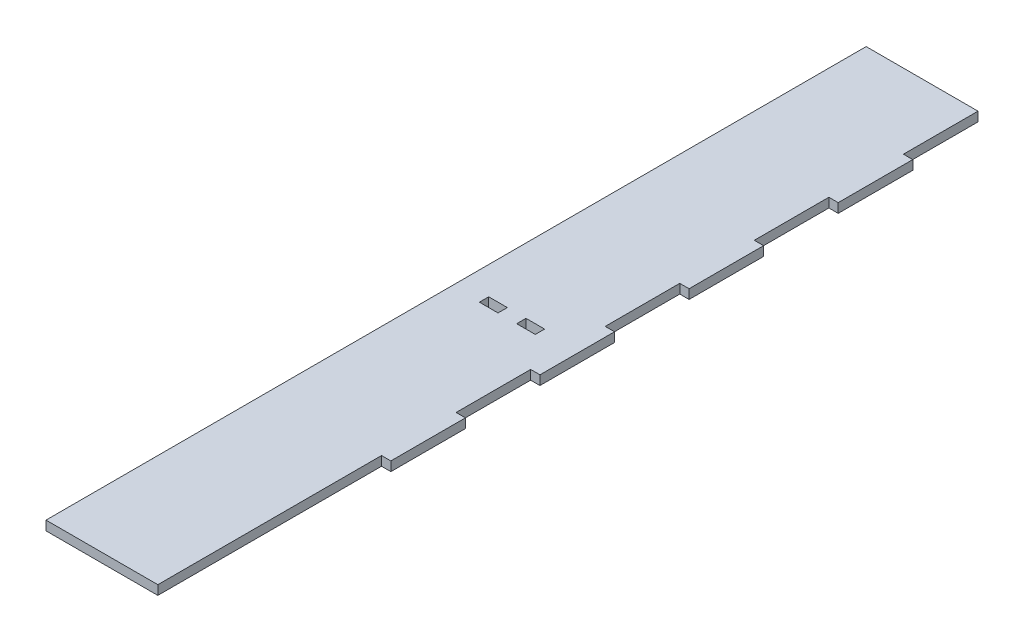
ISO-10303-21;
HEADER;
FILE_DESCRIPTION(('STEP AP214'),'2;1');
FILE_NAME('part.step','',(''),(''),'','','');
FILE_SCHEMA(('AUTOMOTIVE_DESIGN { 1 0 10303 214 1 1 1 1 }'));
ENDSEC;
DATA;
#1=APPLICATION_CONTEXT('core data for automotive mechanical design processes');
#2=APPLICATION_PROTOCOL_DEFINITION('international standard','automotive_design',2000,#1);
#3=PRODUCT_CONTEXT('',#1,'mechanical');
#4=PRODUCT('Part','Part','',(#3));
#5=PRODUCT_RELATED_PRODUCT_CATEGORY('part','',(#4));
#6=PRODUCT_DEFINITION_FORMATION('','',#4);
#7=PRODUCT_DEFINITION_CONTEXT('part definition',#1,'design');
#8=PRODUCT_DEFINITION('design','',#6,#7);
#9=PRODUCT_DEFINITION_SHAPE('','',#8);
#10=(LENGTH_UNIT() NAMED_UNIT(*) SI_UNIT(.MILLI.,.METRE.));
#11=(NAMED_UNIT(*) PLANE_ANGLE_UNIT() SI_UNIT($,.RADIAN.));
#12=(NAMED_UNIT(*) SI_UNIT($,.STERADIAN.) SOLID_ANGLE_UNIT());
#13=UNCERTAINTY_MEASURE_WITH_UNIT(LENGTH_MEASURE(1.E-05),#10,'distance_accuracy_value','');
#14=(GEOMETRIC_REPRESENTATION_CONTEXT(3) GLOBAL_UNCERTAINTY_ASSIGNED_CONTEXT((#13)) GLOBAL_UNIT_ASSIGNED_CONTEXT((#10,
#11,#12)) REPRESENTATION_CONTEXT('',''));
#15=CARTESIAN_POINT('',(0.,0.,0.));
#16=DIRECTION('',(0.,0.,1.));
#17=DIRECTION('',(1.,0.,0.));
#18=AXIS2_PLACEMENT_3D('',#15,#16,#17);
#19=CARTESIAN_POINT('',(38.1,38.1,558.8));
#20=DIRECTION('',(-1.,0.,0.));
#21=DIRECTION('',(0.,0.,1.));
#22=AXIS2_PLACEMENT_3D('',#19,#20,#21);
#23=PLANE('',#22);
#24=DIRECTION('',(0.,1.,0.));
#25=VECTOR('',#24,1.);
#26=CARTESIAN_POINT('',(38.1,44.45,50.8));
#27=LINE('',#26,#25);
#28=CARTESIAN_POINT('',(38.1,38.1,50.8));
#29=VERTEX_POINT('',#28);
#30=CARTESIAN_POINT('',(38.1,44.45,50.8));
#31=VERTEX_POINT('',#30);
#32=EDGE_CURVE('E234',#29,#31,#27,.T.);
#33=ORIENTED_EDGE('',*,*,#32,.F.);
#34=DIRECTION('',(0.,0.,-1.));
#35=VECTOR('',#34,1.);
#36=CARTESIAN_POINT('',(38.1,38.1,558.8));
#37=LINE('',#36,#35);
#38=CARTESIAN_POINT('',(38.1,38.1,0.));
#39=VERTEX_POINT('',#38);
#40=EDGE_CURVE('E221',#29,#39,#37,.T.);
#41=ORIENTED_EDGE('',*,*,#40,.T.);
#42=DIRECTION('',(0.,1.,0.));
#43=VECTOR('',#42,1.);
#44=CARTESIAN_POINT('',(38.1,38.1,0.));
#45=LINE('',#44,#43);
#46=CARTESIAN_POINT('',(38.1,44.45,0.));
#47=VERTEX_POINT('',#46);
#48=EDGE_CURVE('E503',#39,#47,#45,.T.);
#49=ORIENTED_EDGE('',*,*,#48,.T.);
#50=DIRECTION('',(0.,0.,-1.));
#51=VECTOR('',#50,1.);
#52=CARTESIAN_POINT('',(38.1,44.45,558.8));
#53=LINE('',#52,#51);
#54=EDGE_CURVE('E37',#31,#47,#53,.T.);
#55=ORIENTED_EDGE('',*,*,#54,.F.);
#56=EDGE_LOOP('',(#33,#41,#49,#55));
#57=FACE_BOUND('',#56,.T.);
#58=ADVANCED_FACE('F33',(#57),#23,.F.);
#59=DIRECTION('',(0.,-1.,0.));
#60=VECTOR('',#59,1.);
#61=CARTESIAN_POINT('',(38.1,44.45,101.6));
#62=LINE('',#61,#60);
#63=CARTESIAN_POINT('',(38.1,44.45,101.6));
#64=VERTEX_POINT('',#63);
#65=CARTESIAN_POINT('',(38.1,38.1,101.6));
#66=VERTEX_POINT('',#65);
#67=EDGE_CURVE('E58',#64,#66,#62,.T.);
#68=ORIENTED_EDGE('',*,*,#67,.F.);
#69=CARTESIAN_POINT('',(38.1,44.45,152.4));
#70=VERTEX_POINT('',#69);
#71=EDGE_CURVE('E364',#70,#64,#53,.T.);
#72=ORIENTED_EDGE('',*,*,#71,.F.);
#73=DIRECTION('',(0.,1.,0.));
#74=VECTOR('',#73,1.);
#75=CARTESIAN_POINT('',(38.1,44.45,152.4));
#76=LINE('',#75,#74);
#77=CARTESIAN_POINT('',(38.1,38.1,152.4));
#78=VERTEX_POINT('',#77);
#79=EDGE_CURVE('E266',#78,#70,#76,.T.);
#80=ORIENTED_EDGE('',*,*,#79,.F.);
#81=EDGE_CURVE('E231',#78,#66,#37,.T.);
#82=ORIENTED_EDGE('',*,*,#81,.T.);
#83=EDGE_LOOP('',(#68,#72,#80,#82));
#84=FACE_BOUND('',#83,.T.);
#85=ADVANCED_FACE('F393',(#84),#23,.F.);
#86=DIRECTION('',(0.,-1.,0.));
#87=VECTOR('',#86,1.);
#88=CARTESIAN_POINT('',(38.1,44.45,203.2));
#89=LINE('',#88,#87);
#90=CARTESIAN_POINT('',(38.1,44.45,203.2));
#91=VERTEX_POINT('',#90);
#92=CARTESIAN_POINT('',(38.1,38.1,203.2));
#93=VERTEX_POINT('',#92);
#94=EDGE_CURVE('E263',#91,#93,#89,.T.);
#95=ORIENTED_EDGE('',*,*,#94,.F.);
#96=CARTESIAN_POINT('',(38.1,44.45,254.));
#97=VERTEX_POINT('',#96);
#98=EDGE_CURVE('E346',#97,#91,#53,.T.);
#99=ORIENTED_EDGE('',*,*,#98,.F.);
#100=DIRECTION('',(0.,1.,0.));
#101=VECTOR('',#100,1.);
#102=CARTESIAN_POINT('',(38.1,44.45,254.));
#103=LINE('',#102,#101);
#104=CARTESIAN_POINT('',(38.1,38.1,254.));
#105=VERTEX_POINT('',#104);
#106=EDGE_CURVE('E297',#105,#97,#103,.T.);
#107=ORIENTED_EDGE('',*,*,#106,.F.);
#108=EDGE_CURVE('E342',#105,#93,#37,.T.);
#109=ORIENTED_EDGE('',*,*,#108,.T.);
#110=EDGE_LOOP('',(#95,#99,#107,#109));
#111=FACE_BOUND('',#110,.T.);
#112=ADVANCED_FACE('F416',(#111),#23,.F.);
#113=DIRECTION('',(0.,-1.,0.));
#114=VECTOR('',#113,1.);
#115=CARTESIAN_POINT('',(38.1,44.45,304.8));
#116=LINE('',#115,#114);
#117=CARTESIAN_POINT('',(38.1,44.45,304.8));
#118=VERTEX_POINT('',#117);
#119=CARTESIAN_POINT('',(38.1,38.1,304.8));
#120=VERTEX_POINT('',#119);
#121=EDGE_CURVE('E262',#118,#120,#116,.T.);
#122=ORIENTED_EDGE('',*,*,#121,.F.);
#123=CARTESIAN_POINT('',(38.1,44.45,355.6));
#124=VERTEX_POINT('',#123);
#125=EDGE_CURVE('E43',#124,#118,#53,.T.);
#126=ORIENTED_EDGE('',*,*,#125,.F.);
#127=DIRECTION('',(0.,1.,0.));
#128=VECTOR('',#127,1.);
#129=CARTESIAN_POINT('',(38.1,38.1,355.6));
#130=LINE('',#129,#128);
#131=CARTESIAN_POINT('',(38.1,38.1,355.6));
#132=VERTEX_POINT('',#131);
#133=EDGE_CURVE('E333',#132,#124,#130,.T.);
#134=ORIENTED_EDGE('',*,*,#133,.F.);
#135=EDGE_CURVE('E345',#132,#120,#37,.T.);
#136=ORIENTED_EDGE('',*,*,#135,.T.);
#137=EDGE_LOOP('',(#122,#126,#134,#136));
#138=FACE_BOUND('',#137,.T.);
#139=ADVANCED_FACE('F418',(#138),#23,.F.);
#140=DIRECTION('',(0.,-1.,0.));
#141=VECTOR('',#140,1.);
#142=CARTESIAN_POINT('',(38.1,38.1,406.4));
#143=LINE('',#142,#141);
#144=CARTESIAN_POINT('',(38.1,44.45,406.4));
#145=VERTEX_POINT('',#144);
#146=CARTESIAN_POINT('',(38.1,38.1,406.4));
#147=VERTEX_POINT('',#146);
#148=EDGE_CURVE('E294',#145,#147,#143,.T.);
#149=ORIENTED_EDGE('',*,*,#148,.F.);
#150=CARTESIAN_POINT('',(38.1,44.45,558.8));
#151=VERTEX_POINT('',#150);
#152=EDGE_CURVE('E11',#151,#145,#53,.T.);
#153=ORIENTED_EDGE('',*,*,#152,.F.);
#154=DIRECTION('',(0.,1.,0.));
#155=VECTOR('',#154,1.);
#156=CARTESIAN_POINT('',(38.1,38.1,558.8));
#157=LINE('',#156,#155);
#158=CARTESIAN_POINT('',(38.1,38.1,558.8));
#159=VERTEX_POINT('',#158);
#160=EDGE_CURVE('E510',#159,#151,#157,.T.);
#161=ORIENTED_EDGE('',*,*,#160,.F.);
#162=EDGE_CURVE('E361',#159,#147,#37,.T.);
#163=ORIENTED_EDGE('',*,*,#162,.T.);
#164=EDGE_LOOP('',(#149,#153,#161,#163));
#165=FACE_BOUND('',#164,.T.);
#166=ADVANCED_FACE('F35',(#165),#23,.F.);
#167=CARTESIAN_POINT('',(38.1,44.45,558.8));
#168=DIRECTION('',(0.,-1.,0.));
#169=DIRECTION('',(0.,0.,-1.));
#170=AXIS2_PLACEMENT_3D('',#167,#168,#169);
#171=PLANE('',#170);
#172=DIRECTION('',(-1.,0.,0.));
#173=VECTOR('',#172,1.);
#174=CARTESIAN_POINT('',(-6.35,44.45,276.225));
#175=LINE('',#174,#173);
#176=CARTESIAN_POINT('',(-6.35,44.45,276.225));
#177=VERTEX_POINT('',#176);
#178=CARTESIAN_POINT('',(-19.05,44.45,276.225));
#179=VERTEX_POINT('',#178);
#180=EDGE_CURVE('E461',#177,#179,#175,.T.);
#181=ORIENTED_EDGE('',*,*,#180,.F.);
#182=DIRECTION('',(0.,0.,-1.));
#183=VECTOR('',#182,1.);
#184=CARTESIAN_POINT('',(-6.35,44.45,282.575));
#185=LINE('',#184,#183);
#186=CARTESIAN_POINT('',(-6.35,44.45,282.575));
#187=VERTEX_POINT('',#186);
#188=EDGE_CURVE('E324',#187,#177,#185,.T.);
#189=ORIENTED_EDGE('',*,*,#188,.F.);
#190=DIRECTION('',(1.,0.,0.));
#191=VECTOR('',#190,1.);
#192=CARTESIAN_POINT('',(-6.35,44.45,282.575));
#193=LINE('',#192,#191);
#194=CARTESIAN_POINT('',(-19.05,44.45,282.575));
#195=VERTEX_POINT('',#194);
#196=EDGE_CURVE('E450',#195,#187,#193,.T.);
#197=ORIENTED_EDGE('',*,*,#196,.F.);
#198=DIRECTION('',(0.,0.,1.));
#199=VECTOR('',#198,1.);
#200=CARTESIAN_POINT('',(-19.05,44.45,282.575));
#201=LINE('',#200,#199);
#202=EDGE_CURVE('E464',#179,#195,#201,.T.);
#203=ORIENTED_EDGE('',*,*,#202,.F.);
#204=EDGE_LOOP('',(#181,#189,#197,#203));
#205=FACE_BOUND('',#204,.T.);
#206=DIRECTION('',(-1.,0.,0.));
#207=VECTOR('',#206,1.);
#208=CARTESIAN_POINT('',(19.05,44.45,276.225));
#209=LINE('',#208,#207);
#210=CARTESIAN_POINT('',(19.05,44.45,276.225));
#211=VERTEX_POINT('',#210);
#212=CARTESIAN_POINT('',(6.35,44.45,276.225));
#213=VERTEX_POINT('',#212);
#214=EDGE_CURVE('E493',#211,#213,#209,.T.);
#215=ORIENTED_EDGE('',*,*,#214,.F.);
#216=DIRECTION('',(0.,0.,-1.));
#217=VECTOR('',#216,1.);
#218=CARTESIAN_POINT('',(19.05,44.45,282.575));
#219=LINE('',#218,#217);
#220=CARTESIAN_POINT('',(19.05,44.45,282.575));
#221=VERTEX_POINT('',#220);
#222=EDGE_CURVE('E471',#221,#211,#219,.T.);
#223=ORIENTED_EDGE('',*,*,#222,.F.);
#224=DIRECTION('',(1.,0.,0.));
#225=VECTOR('',#224,1.);
#226=CARTESIAN_POINT('',(19.05,44.45,282.575));
#227=LINE('',#226,#225);
#228=CARTESIAN_POINT('',(6.35,44.45,282.575));
#229=VERTEX_POINT('',#228);
#230=EDGE_CURVE('E482',#229,#221,#227,.T.);
#231=ORIENTED_EDGE('',*,*,#230,.F.);
#232=DIRECTION('',(0.,0.,1.));
#233=VECTOR('',#232,1.);
#234=CARTESIAN_POINT('',(6.35,44.45,282.575));
#235=LINE('',#234,#233);
#236=EDGE_CURVE('E496',#213,#229,#235,.T.);
#237=ORIENTED_EDGE('',*,*,#236,.F.);
#238=EDGE_LOOP('',(#215,#223,#231,#237));
#239=FACE_BOUND('',#238,.T.);
#240=DIRECTION('',(-1.,0.,0.));
#241=VECTOR('',#240,1.);
#242=CARTESIAN_POINT('',(38.1,44.45,0.));
#243=LINE('',#242,#241);
#244=CARTESIAN_POINT('',(-38.1,44.45,0.));
#245=VERTEX_POINT('',#244);
#246=EDGE_CURVE('E517',#47,#245,#243,.T.);
#247=ORIENTED_EDGE('',*,*,#246,.T.);
#248=DIRECTION('',(0.,0.,-1.));
#249=VECTOR('',#248,1.);
#250=CARTESIAN_POINT('',(-38.1,44.45,558.8));
#251=LINE('',#250,#249);
#252=CARTESIAN_POINT('',(-38.1,44.45,558.8));
#253=VERTEX_POINT('',#252);
#254=EDGE_CURVE('E366',#253,#245,#251,.T.);
#255=ORIENTED_EDGE('',*,*,#254,.F.);
#256=DIRECTION('',(-1.,0.,0.));
#257=VECTOR('',#256,1.);
#258=CARTESIAN_POINT('',(38.1,44.45,558.8));
#259=LINE('',#258,#257);
#260=EDGE_CURVE('E436',#151,#253,#259,.T.);
#261=ORIENTED_EDGE('',*,*,#260,.F.);
#262=ORIENTED_EDGE('',*,*,#152,.T.);
#263=DIRECTION('',(-1.,0.,0.));
#264=VECTOR('',#263,1.);
#265=CARTESIAN_POINT('',(95.6453367016958,44.45,406.4));
#266=LINE('',#265,#264);
#267=CARTESIAN_POINT('',(44.45,44.45,406.4));
#268=VERTEX_POINT('',#267);
#269=EDGE_CURVE('E336',#268,#145,#266,.T.);
#270=ORIENTED_EDGE('',*,*,#269,.F.);
#271=DIRECTION('',(0.,0.,-1.));
#272=VECTOR('',#271,1.);
#273=CARTESIAN_POINT('',(44.45,44.45,406.4));
#274=LINE('',#273,#272);
#275=CARTESIAN_POINT('',(44.45,44.45,355.6));
#276=VERTEX_POINT('',#275);
#277=EDGE_CURVE('E318',#268,#276,#274,.T.);
#278=ORIENTED_EDGE('',*,*,#277,.T.);
#279=DIRECTION('',(-1.,0.,0.));
#280=VECTOR('',#279,1.);
#281=CARTESIAN_POINT('',(95.6453367016958,44.45,355.6));
#282=LINE('',#281,#280);
#283=EDGE_CURVE('E339',#276,#124,#282,.T.);
#284=ORIENTED_EDGE('',*,*,#283,.T.);
#285=ORIENTED_EDGE('',*,*,#125,.T.);
#286=DIRECTION('',(-1.,0.,0.));
#287=VECTOR('',#286,1.);
#288=CARTESIAN_POINT('',(95.6453367016958,44.45,304.8));
#289=LINE('',#288,#287);
#290=CARTESIAN_POINT('',(44.45,44.45,304.8));
#291=VERTEX_POINT('',#290);
#292=EDGE_CURVE('E300',#291,#118,#289,.T.);
#293=ORIENTED_EDGE('',*,*,#292,.F.);
#294=DIRECTION('',(0.,0.,-1.));
#295=VECTOR('',#294,1.);
#296=CARTESIAN_POINT('',(44.45,44.45,304.8));
#297=LINE('',#296,#295);
#298=CARTESIAN_POINT('',(44.45,44.45,254.));
#299=VERTEX_POINT('',#298);
#300=EDGE_CURVE('E288',#291,#299,#297,.T.);
#301=ORIENTED_EDGE('',*,*,#300,.T.);
#302=DIRECTION('',(-1.,0.,0.));
#303=VECTOR('',#302,1.);
#304=CARTESIAN_POINT('',(95.6453367016958,44.45,254.));
#305=LINE('',#304,#303);
#306=EDGE_CURVE('E303',#299,#97,#305,.T.);
#307=ORIENTED_EDGE('',*,*,#306,.T.);
#308=ORIENTED_EDGE('',*,*,#98,.T.);
#309=DIRECTION('',(-1.,0.,0.));
#310=VECTOR('',#309,1.);
#311=CARTESIAN_POINT('',(95.6453367016958,44.45,203.2));
#312=LINE('',#311,#310);
#313=CARTESIAN_POINT('',(44.45,44.45,203.2));
#314=VERTEX_POINT('',#313);
#315=EDGE_CURVE('E270',#314,#91,#312,.T.);
#316=ORIENTED_EDGE('',*,*,#315,.F.);
#317=DIRECTION('',(0.,0.,-1.));
#318=VECTOR('',#317,1.);
#319=CARTESIAN_POINT('',(44.45,44.45,203.2));
#320=LINE('',#319,#318);
#321=CARTESIAN_POINT('',(44.45,44.45,152.4));
#322=VERTEX_POINT('',#321);
#323=EDGE_CURVE('E256',#314,#322,#320,.T.);
#324=ORIENTED_EDGE('',*,*,#323,.T.);
#325=DIRECTION('',(-1.,0.,0.));
#326=VECTOR('',#325,1.);
#327=CARTESIAN_POINT('',(95.6453367016958,44.45,152.4));
#328=LINE('',#327,#326);
#329=EDGE_CURVE('E273',#322,#70,#328,.T.);
#330=ORIENTED_EDGE('',*,*,#329,.T.);
#331=ORIENTED_EDGE('',*,*,#71,.T.);
#332=DIRECTION('',(-1.,0.,0.));
#333=VECTOR('',#332,1.);
#334=CARTESIAN_POINT('',(95.6453367016958,44.45,101.6));
#335=LINE('',#334,#333);
#336=CARTESIAN_POINT('',(44.45,44.45,101.6));
#337=VERTEX_POINT('',#336);
#338=EDGE_CURVE('E237',#337,#64,#335,.T.);
#339=ORIENTED_EDGE('',*,*,#338,.F.);
#340=DIRECTION('',(0.,0.,-1.));
#341=VECTOR('',#340,1.);
#342=CARTESIAN_POINT('',(44.45,44.45,101.6));
#343=LINE('',#342,#341);
#344=CARTESIAN_POINT('',(44.45,44.45,50.8));
#345=VERTEX_POINT('',#344);
#346=EDGE_CURVE('E245',#337,#345,#343,.T.);
#347=ORIENTED_EDGE('',*,*,#346,.T.);
#348=DIRECTION('',(-1.,0.,0.));
#349=VECTOR('',#348,1.);
#350=CARTESIAN_POINT('',(95.6453367016958,44.45,50.8));
#351=LINE('',#350,#349);
#352=EDGE_CURVE('E242',#345,#31,#351,.T.);
#353=ORIENTED_EDGE('',*,*,#352,.T.);
#354=ORIENTED_EDGE('',*,*,#54,.T.);
#355=EDGE_LOOP('',(#247,#255,#261,#262,#270,#278,#284,#285,#293,#301,#307,#308,#316,#324,#330,
#331,#339,#347,#353,#354));
#356=FACE_BOUND('',#355,.T.);
#357=ADVANCED_FACE('F377',(#205,#239,#356),#171,.F.);
#358=CARTESIAN_POINT('',(-38.1,38.1,558.8));
#359=DIRECTION('',(1.,0.,0.));
#360=DIRECTION('',(0.,0.,-1.));
#361=AXIS2_PLACEMENT_3D('',#358,#359,#360);
#362=PLANE('',#361);
#363=DIRECTION('',(0.,-1.,0.));
#364=VECTOR('',#363,1.);
#365=CARTESIAN_POINT('',(-38.1,38.1,0.));
#366=LINE('',#365,#364);
#367=CARTESIAN_POINT('',(-38.1,38.1,0.));
#368=VERTEX_POINT('',#367);
#369=EDGE_CURVE('E518',#245,#368,#366,.T.);
#370=ORIENTED_EDGE('',*,*,#369,.T.);
#371=DIRECTION('',(0.,0.,-1.));
#372=VECTOR('',#371,1.);
#373=CARTESIAN_POINT('',(-38.1,38.1,558.8));
#374=LINE('',#373,#372);
#375=CARTESIAN_POINT('',(-38.1,38.1,558.8));
#376=VERTEX_POINT('',#375);
#377=EDGE_CURVE('E352',#376,#368,#374,.T.);
#378=ORIENTED_EDGE('',*,*,#377,.F.);
#379=DIRECTION('',(0.,-1.,0.));
#380=VECTOR('',#379,1.);
#381=CARTESIAN_POINT('',(-38.1,38.1,558.8));
#382=LINE('',#381,#380);
#383=EDGE_CURVE('E513',#253,#376,#382,.T.);
#384=ORIENTED_EDGE('',*,*,#383,.F.);
#385=ORIENTED_EDGE('',*,*,#254,.T.);
#386=EDGE_LOOP('',(#370,#378,#384,#385));
#387=FACE_BOUND('',#386,.T.);
#388=ADVANCED_FACE('F424',(#387),#362,.F.);
#389=CARTESIAN_POINT('',(38.1,38.1,558.8));
#390=DIRECTION('',(0.,1.,0.));
#391=DIRECTION('',(0.,0.,1.));
#392=AXIS2_PLACEMENT_3D('',#389,#390,#391);
#393=PLANE('',#392);
#394=DIRECTION('',(1.,0.,0.));
#395=VECTOR('',#394,1.);
#396=CARTESIAN_POINT('',(-6.35,38.1,282.575));
#397=LINE('',#396,#395);
#398=CARTESIAN_POINT('',(-19.05,38.1,282.575));
#399=VERTEX_POINT('',#398);
#400=CARTESIAN_POINT('',(-6.35,38.1,282.575));
#401=VERTEX_POINT('',#400);
#402=EDGE_CURVE('E456',#399,#401,#397,.T.);
#403=ORIENTED_EDGE('',*,*,#402,.T.);
#404=DIRECTION('',(0.,0.,-1.));
#405=VECTOR('',#404,1.);
#406=CARTESIAN_POINT('',(-6.35,38.1,282.575));
#407=LINE('',#406,#405);
#408=CARTESIAN_POINT('',(-6.35,38.1,276.225));
#409=VERTEX_POINT('',#408);
#410=EDGE_CURVE('E446',#401,#409,#407,.T.);
#411=ORIENTED_EDGE('',*,*,#410,.T.);
#412=DIRECTION('',(-1.,0.,0.));
#413=VECTOR('',#412,1.);
#414=CARTESIAN_POINT('',(-6.35,38.1,276.225));
#415=LINE('',#414,#413);
#416=CARTESIAN_POINT('',(-19.05,38.1,276.225));
#417=VERTEX_POINT('',#416);
#418=EDGE_CURVE('E449',#409,#417,#415,.T.);
#419=ORIENTED_EDGE('',*,*,#418,.T.);
#420=DIRECTION('',(0.,0.,1.));
#421=VECTOR('',#420,1.);
#422=CARTESIAN_POINT('',(-19.05,38.1,282.575));
#423=LINE('',#422,#421);
#424=EDGE_CURVE('E453',#417,#399,#423,.T.);
#425=ORIENTED_EDGE('',*,*,#424,.T.);
#426=EDGE_LOOP('',(#403,#411,#419,#425));
#427=FACE_BOUND('',#426,.T.);
#428=DIRECTION('',(1.,0.,0.));
#429=VECTOR('',#428,1.);
#430=CARTESIAN_POINT('',(19.05,38.1,282.575));
#431=LINE('',#430,#429);
#432=CARTESIAN_POINT('',(6.35,38.1,282.575));
#433=VERTEX_POINT('',#432);
#434=CARTESIAN_POINT('',(19.05,38.1,282.575));
#435=VERTEX_POINT('',#434);
#436=EDGE_CURVE('E488',#433,#435,#431,.T.);
#437=ORIENTED_EDGE('',*,*,#436,.T.);
#438=DIRECTION('',(0.,0.,-1.));
#439=VECTOR('',#438,1.);
#440=CARTESIAN_POINT('',(19.05,38.1,282.575));
#441=LINE('',#440,#439);
#442=CARTESIAN_POINT('',(19.05,38.1,276.225));
#443=VERTEX_POINT('',#442);
#444=EDGE_CURVE('E478',#435,#443,#441,.T.);
#445=ORIENTED_EDGE('',*,*,#444,.T.);
#446=DIRECTION('',(-1.,0.,0.));
#447=VECTOR('',#446,1.);
#448=CARTESIAN_POINT('',(19.05,38.1,276.225));
#449=LINE('',#448,#447);
#450=CARTESIAN_POINT('',(6.35,38.1,276.225));
#451=VERTEX_POINT('',#450);
#452=EDGE_CURVE('E481',#443,#451,#449,.T.);
#453=ORIENTED_EDGE('',*,*,#452,.T.);
#454=DIRECTION('',(0.,0.,1.));
#455=VECTOR('',#454,1.);
#456=CARTESIAN_POINT('',(6.35,38.1,282.575));
#457=LINE('',#456,#455);
#458=EDGE_CURVE('E485',#451,#433,#457,.T.);
#459=ORIENTED_EDGE('',*,*,#458,.T.);
#460=EDGE_LOOP('',(#437,#445,#453,#459));
#461=FACE_BOUND('',#460,.T.);
#462=DIRECTION('',(1.,0.,0.));
#463=VECTOR('',#462,1.);
#464=CARTESIAN_POINT('',(38.1,38.1,0.));
#465=LINE('',#464,#463);
#466=EDGE_CURVE('E229',#368,#39,#465,.T.);
#467=ORIENTED_EDGE('',*,*,#466,.T.);
#468=ORIENTED_EDGE('',*,*,#40,.F.);
#469=DIRECTION('',(-1.,0.,0.));
#470=VECTOR('',#469,1.);
#471=CARTESIAN_POINT('',(95.6453367016958,38.1,50.8));
#472=LINE('',#471,#470);
#473=CARTESIAN_POINT('',(44.45,38.1,50.8));
#474=VERTEX_POINT('',#473);
#475=EDGE_CURVE('E225',#474,#29,#472,.T.);
#476=ORIENTED_EDGE('',*,*,#475,.F.);
#477=DIRECTION('',(0.,0.,1.));
#478=VECTOR('',#477,1.);
#479=CARTESIAN_POINT('',(44.45,38.1,101.6));
#480=LINE('',#479,#478);
#481=CARTESIAN_POINT('',(44.45,38.1,101.6));
#482=VERTEX_POINT('',#481);
#483=EDGE_CURVE('E395',#474,#482,#480,.T.);
#484=ORIENTED_EDGE('',*,*,#483,.T.);
#485=DIRECTION('',(-1.,0.,0.));
#486=VECTOR('',#485,1.);
#487=CARTESIAN_POINT('',(95.6453367016958,38.1,101.6));
#488=LINE('',#487,#486);
#489=EDGE_CURVE('E241',#482,#66,#488,.T.);
#490=ORIENTED_EDGE('',*,*,#489,.T.);
#491=ORIENTED_EDGE('',*,*,#81,.F.);
#492=DIRECTION('',(-1.,0.,0.));
#493=VECTOR('',#492,1.);
#494=CARTESIAN_POINT('',(95.6453367016958,38.1,152.4));
#495=LINE('',#494,#493);
#496=CARTESIAN_POINT('',(44.45,38.1,152.4));
#497=VERTEX_POINT('',#496);
#498=EDGE_CURVE('E276',#497,#78,#495,.T.);
#499=ORIENTED_EDGE('',*,*,#498,.F.);
#500=DIRECTION('',(0.,0.,1.));
#501=VECTOR('',#500,1.);
#502=CARTESIAN_POINT('',(44.45,38.1,203.2));
#503=LINE('',#502,#501);
#504=CARTESIAN_POINT('',(44.45,38.1,203.2));
#505=VERTEX_POINT('',#504);
#506=EDGE_CURVE('E255',#497,#505,#503,.T.);
#507=ORIENTED_EDGE('',*,*,#506,.T.);
#508=DIRECTION('',(-1.,0.,0.));
#509=VECTOR('',#508,1.);
#510=CARTESIAN_POINT('',(95.6453367016958,38.1,203.2));
#511=LINE('',#510,#509);
#512=EDGE_CURVE('E279',#505,#93,#511,.T.);
#513=ORIENTED_EDGE('',*,*,#512,.T.);
#514=ORIENTED_EDGE('',*,*,#108,.F.);
#515=DIRECTION('',(-1.,0.,0.));
#516=VECTOR('',#515,1.);
#517=CARTESIAN_POINT('',(95.6453367016958,38.1,254.));
#518=LINE('',#517,#516);
#519=CARTESIAN_POINT('',(44.45,38.1,254.));
#520=VERTEX_POINT('',#519);
#521=EDGE_CURVE('E306',#520,#105,#518,.T.);
#522=ORIENTED_EDGE('',*,*,#521,.F.);
#523=DIRECTION('',(0.,0.,1.));
#524=VECTOR('',#523,1.);
#525=CARTESIAN_POINT('',(44.45,38.1,304.8));
#526=LINE('',#525,#524);
#527=CARTESIAN_POINT('',(44.45,38.1,304.8));
#528=VERTEX_POINT('',#527);
#529=EDGE_CURVE('E287',#520,#528,#526,.T.);
#530=ORIENTED_EDGE('',*,*,#529,.T.);
#531=DIRECTION('',(-1.,0.,0.));
#532=VECTOR('',#531,1.);
#533=CARTESIAN_POINT('',(95.6453367016958,38.1,304.8));
#534=LINE('',#533,#532);
#535=EDGE_CURVE('E309',#528,#120,#534,.T.);
#536=ORIENTED_EDGE('',*,*,#535,.T.);
#537=ORIENTED_EDGE('',*,*,#135,.F.);
#538=DIRECTION('',(-1.,0.,0.));
#539=VECTOR('',#538,1.);
#540=CARTESIAN_POINT('',(95.6453367016958,38.1,355.6));
#541=LINE('',#540,#539);
#542=CARTESIAN_POINT('',(44.45,38.1,355.6));
#543=VERTEX_POINT('',#542);
#544=EDGE_CURVE('E444',#543,#132,#541,.T.);
#545=ORIENTED_EDGE('',*,*,#544,.F.);
#546=DIRECTION('',(0.,0.,1.));
#547=VECTOR('',#546,1.);
#548=CARTESIAN_POINT('',(44.45,38.1,406.4));
#549=LINE('',#548,#547);
#550=CARTESIAN_POINT('',(44.45,38.1,406.4));
#551=VERTEX_POINT('',#550);
#552=EDGE_CURVE('E317',#543,#551,#549,.T.);
#553=ORIENTED_EDGE('',*,*,#552,.T.);
#554=DIRECTION('',(-1.,0.,0.));
#555=VECTOR('',#554,1.);
#556=CARTESIAN_POINT('',(95.6453367016958,38.1,406.4));
#557=LINE('',#556,#555);
#558=EDGE_CURVE('E439',#551,#147,#557,.T.);
#559=ORIENTED_EDGE('',*,*,#558,.T.);
#560=ORIENTED_EDGE('',*,*,#162,.F.);
#561=DIRECTION('',(1.,0.,0.));
#562=VECTOR('',#561,1.);
#563=CARTESIAN_POINT('',(38.1,38.1,558.8));
#564=LINE('',#563,#562);
#565=EDGE_CURVE('E232',#376,#159,#564,.T.);
#566=ORIENTED_EDGE('',*,*,#565,.F.);
#567=ORIENTED_EDGE('',*,*,#377,.T.);
#568=EDGE_LOOP('',(#467,#468,#476,#484,#490,#491,#499,#507,#513,#514,#522,#530,#536,#537,#545,
#553,#559,#560,#566,#567));
#569=FACE_BOUND('',#568,.T.);
#570=ADVANCED_FACE('F222',(#427,#461,#569),#393,.F.);
#571=CARTESIAN_POINT('',(0.,0.,558.8));
#572=DIRECTION('',(0.,0.,1.));
#573=DIRECTION('',(1.,0.,0.));
#574=AXIS2_PLACEMENT_3D('',#571,#572,#573);
#575=PLANE('',#574);
#576=ORIENTED_EDGE('',*,*,#160,.T.);
#577=ORIENTED_EDGE('',*,*,#260,.T.);
#578=ORIENTED_EDGE('',*,*,#383,.T.);
#579=ORIENTED_EDGE('',*,*,#565,.T.);
#580=EDGE_LOOP('',(#576,#577,#578,#579));
#581=FACE_BOUND('',#580,.T.);
#582=ADVANCED_FACE('F529',(#581),#575,.T.);
#583=CARTESIAN_POINT('',(0.,0.,0.));
#584=DIRECTION('',(0.,0.,1.));
#585=DIRECTION('',(1.,0.,0.));
#586=AXIS2_PLACEMENT_3D('',#583,#584,#585);
#587=PLANE('',#586);
#588=ORIENTED_EDGE('',*,*,#48,.F.);
#589=ORIENTED_EDGE('',*,*,#466,.F.);
#590=ORIENTED_EDGE('',*,*,#369,.F.);
#591=ORIENTED_EDGE('',*,*,#246,.F.);
#592=EDGE_LOOP('',(#588,#589,#590,#591));
#593=FACE_BOUND('',#592,.T.);
#594=ADVANCED_FACE('F527',(#593),#587,.F.);
#595=CARTESIAN_POINT('',(19.05,38.1,282.575));
#596=DIRECTION('',(1.,0.,0.));
#597=DIRECTION('',(0.,0.,-1.));
#598=AXIS2_PLACEMENT_3D('',#595,#596,#597);
#599=PLANE('',#598);
#600=ORIENTED_EDGE('',*,*,#222,.T.);
#601=DIRECTION('',(0.,1.,0.));
#602=VECTOR('',#601,1.);
#603=CARTESIAN_POINT('',(19.05,38.1,276.225));
#604=LINE('',#603,#602);
#605=EDGE_CURVE('E491',#443,#211,#604,.T.);
#606=ORIENTED_EDGE('',*,*,#605,.F.);
#607=ORIENTED_EDGE('',*,*,#444,.F.);
#608=DIRECTION('',(0.,1.,0.));
#609=VECTOR('',#608,1.);
#610=CARTESIAN_POINT('',(19.05,38.1,282.575));
#611=LINE('',#610,#609);
#612=EDGE_CURVE('E501',#435,#221,#611,.T.);
#613=ORIENTED_EDGE('',*,*,#612,.T.);
#614=EDGE_LOOP('',(#600,#606,#607,#613));
#615=FACE_BOUND('',#614,.T.);
#616=ADVANCED_FACE('F692',(#615),#599,.F.);
#617=CARTESIAN_POINT('',(19.05,38.1,282.575));
#618=DIRECTION('',(0.,0.,1.));
#619=DIRECTION('',(1.,0.,0.));
#620=AXIS2_PLACEMENT_3D('',#617,#618,#619);
#621=PLANE('',#620);
#622=ORIENTED_EDGE('',*,*,#230,.T.);
#623=ORIENTED_EDGE('',*,*,#612,.F.);
#624=ORIENTED_EDGE('',*,*,#436,.F.);
#625=DIRECTION('',(0.,1.,0.));
#626=VECTOR('',#625,1.);
#627=CARTESIAN_POINT('',(6.35,38.1,282.575));
#628=LINE('',#627,#626);
#629=EDGE_CURVE('E504',#433,#229,#628,.T.);
#630=ORIENTED_EDGE('',*,*,#629,.T.);
#631=EDGE_LOOP('',(#622,#623,#624,#630));
#632=FACE_BOUND('',#631,.T.);
#633=ADVANCED_FACE('F688',(#632),#621,.F.);
#634=CARTESIAN_POINT('',(6.35,38.1,282.575));
#635=DIRECTION('',(-1.,0.,0.));
#636=DIRECTION('',(0.,0.,1.));
#637=AXIS2_PLACEMENT_3D('',#634,#635,#636);
#638=PLANE('',#637);
#639=ORIENTED_EDGE('',*,*,#236,.T.);
#640=ORIENTED_EDGE('',*,*,#629,.F.);
#641=ORIENTED_EDGE('',*,*,#458,.F.);
#642=DIRECTION('',(0.,1.,0.));
#643=VECTOR('',#642,1.);
#644=CARTESIAN_POINT('',(6.35,38.1,276.225));
#645=LINE('',#644,#643);
#646=EDGE_CURVE('E506',#451,#213,#645,.T.);
#647=ORIENTED_EDGE('',*,*,#646,.T.);
#648=EDGE_LOOP('',(#639,#640,#641,#647));
#649=FACE_BOUND('',#648,.T.);
#650=ADVANCED_FACE('F691',(#649),#638,.F.);
#651=CARTESIAN_POINT('',(19.05,38.1,276.225));
#652=DIRECTION('',(0.,0.,-1.));
#653=DIRECTION('',(-1.,0.,0.));
#654=AXIS2_PLACEMENT_3D('',#651,#652,#653);
#655=PLANE('',#654);
#656=ORIENTED_EDGE('',*,*,#214,.T.);
#657=ORIENTED_EDGE('',*,*,#646,.F.);
#658=ORIENTED_EDGE('',*,*,#452,.F.);
#659=ORIENTED_EDGE('',*,*,#605,.T.);
#660=EDGE_LOOP('',(#656,#657,#658,#659));
#661=FACE_BOUND('',#660,.T.);
#662=ADVANCED_FACE('F686',(#661),#655,.F.);
#663=CARTESIAN_POINT('',(-6.35,38.1,282.575));
#664=DIRECTION('',(1.,0.,0.));
#665=DIRECTION('',(0.,0.,-1.));
#666=AXIS2_PLACEMENT_3D('',#663,#664,#665);
#667=PLANE('',#666);
#668=ORIENTED_EDGE('',*,*,#188,.T.);
#669=DIRECTION('',(0.,1.,0.));
#670=VECTOR('',#669,1.);
#671=CARTESIAN_POINT('',(-6.35,38.1,276.225));
#672=LINE('',#671,#670);
#673=EDGE_CURVE('E459',#409,#177,#672,.T.);
#674=ORIENTED_EDGE('',*,*,#673,.F.);
#675=ORIENTED_EDGE('',*,*,#410,.F.);
#676=DIRECTION('',(0.,1.,0.));
#677=VECTOR('',#676,1.);
#678=CARTESIAN_POINT('',(-6.35,38.1,282.575));
#679=LINE('',#678,#677);
#680=EDGE_CURVE('E469',#401,#187,#679,.T.);
#681=ORIENTED_EDGE('',*,*,#680,.T.);
#682=EDGE_LOOP('',(#668,#674,#675,#681));
#683=FACE_BOUND('',#682,.T.);
#684=ADVANCED_FACE('F677',(#683),#667,.F.);
#685=CARTESIAN_POINT('',(-6.35,38.1,282.575));
#686=DIRECTION('',(0.,0.,1.));
#687=DIRECTION('',(1.,0.,0.));
#688=AXIS2_PLACEMENT_3D('',#685,#686,#687);
#689=PLANE('',#688);
#690=ORIENTED_EDGE('',*,*,#196,.T.);
#691=ORIENTED_EDGE('',*,*,#680,.F.);
#692=ORIENTED_EDGE('',*,*,#402,.F.);
#693=DIRECTION('',(0.,1.,0.));
#694=VECTOR('',#693,1.);
#695=CARTESIAN_POINT('',(-19.05,38.1,282.575));
#696=LINE('',#695,#694);
#697=EDGE_CURVE('E472',#399,#195,#696,.T.);
#698=ORIENTED_EDGE('',*,*,#697,.T.);
#699=EDGE_LOOP('',(#690,#691,#692,#698));
#700=FACE_BOUND('',#699,.T.);
#701=ADVANCED_FACE('F673',(#700),#689,.F.);
#702=CARTESIAN_POINT('',(-19.05,38.1,282.575));
#703=DIRECTION('',(-1.,0.,0.));
#704=DIRECTION('',(0.,0.,1.));
#705=AXIS2_PLACEMENT_3D('',#702,#703,#704);
#706=PLANE('',#705);
#707=ORIENTED_EDGE('',*,*,#202,.T.);
#708=ORIENTED_EDGE('',*,*,#697,.F.);
#709=ORIENTED_EDGE('',*,*,#424,.F.);
#710=DIRECTION('',(0.,1.,0.));
#711=VECTOR('',#710,1.);
#712=CARTESIAN_POINT('',(-19.05,38.1,276.225));
#713=LINE('',#712,#711);
#714=EDGE_CURVE('E474',#417,#179,#713,.T.);
#715=ORIENTED_EDGE('',*,*,#714,.T.);
#716=EDGE_LOOP('',(#707,#708,#709,#715));
#717=FACE_BOUND('',#716,.T.);
#718=ADVANCED_FACE('F676',(#717),#706,.F.);
#719=CARTESIAN_POINT('',(-6.35,38.1,276.225));
#720=DIRECTION('',(0.,0.,-1.));
#721=DIRECTION('',(-1.,0.,0.));
#722=AXIS2_PLACEMENT_3D('',#719,#720,#721);
#723=PLANE('',#722);
#724=ORIENTED_EDGE('',*,*,#180,.T.);
#725=ORIENTED_EDGE('',*,*,#714,.F.);
#726=ORIENTED_EDGE('',*,*,#418,.F.);
#727=ORIENTED_EDGE('',*,*,#673,.T.);
#728=EDGE_LOOP('',(#724,#725,#726,#727));
#729=FACE_BOUND('',#728,.T.);
#730=ADVANCED_FACE('F585',(#729),#723,.F.);
#731=CARTESIAN_POINT('',(95.6453367016958,38.1,355.6));
#732=DIRECTION('',(0.,0.,1.));
#733=DIRECTION('',(1.,0.,0.));
#734=AXIS2_PLACEMENT_3D('',#731,#732,#733);
#735=PLANE('',#734);
#736=ORIENTED_EDGE('',*,*,#283,.F.);
#737=DIRECTION('',(0.,-1.,0.));
#738=VECTOR('',#737,1.);
#739=CARTESIAN_POINT('',(44.45,38.1,355.6));
#740=LINE('',#739,#738);
#741=EDGE_CURVE('E314',#276,#543,#740,.T.);
#742=ORIENTED_EDGE('',*,*,#741,.T.);
#743=ORIENTED_EDGE('',*,*,#544,.T.);
#744=ORIENTED_EDGE('',*,*,#133,.T.);
#745=EDGE_LOOP('',(#736,#742,#743,#744));
#746=FACE_BOUND('',#745,.T.);
#747=ADVANCED_FACE('F581',(#746),#735,.F.);
#748=CARTESIAN_POINT('',(95.6453367016958,38.1,406.4));
#749=DIRECTION('',(0.,0.,-1.));
#750=DIRECTION('',(-1.,0.,0.));
#751=AXIS2_PLACEMENT_3D('',#748,#749,#750);
#752=PLANE('',#751);
#753=ORIENTED_EDGE('',*,*,#558,.F.);
#754=DIRECTION('',(0.,1.,0.));
#755=VECTOR('',#754,1.);
#756=CARTESIAN_POINT('',(44.45,38.1,406.4));
#757=LINE('',#756,#755);
#758=EDGE_CURVE('E321',#551,#268,#757,.T.);
#759=ORIENTED_EDGE('',*,*,#758,.T.);
#760=ORIENTED_EDGE('',*,*,#269,.T.);
#761=ORIENTED_EDGE('',*,*,#148,.T.);
#762=EDGE_LOOP('',(#753,#759,#760,#761));
#763=FACE_BOUND('',#762,.T.);
#764=ADVANCED_FACE('F438',(#763),#752,.F.);
#765=CARTESIAN_POINT('',(44.45,-44.45,457.2));
#766=DIRECTION('',(-1.,0.,0.));
#767=DIRECTION('',(0.,-1.,0.));
#768=AXIS2_PLACEMENT_3D('',#765,#766,#767);
#769=PLANE('',#768);
#770=ORIENTED_EDGE('',*,*,#552,.F.);
#771=ORIENTED_EDGE('',*,*,#741,.F.);
#772=ORIENTED_EDGE('',*,*,#277,.F.);
#773=ORIENTED_EDGE('',*,*,#758,.F.);
#774=EDGE_LOOP('',(#770,#771,#772,#773));
#775=FACE_BOUND('',#774,.T.);
#776=ADVANCED_FACE('F441',(#775),#769,.F.);
#777=CARTESIAN_POINT('',(95.6453367016958,44.45,254.));
#778=DIRECTION('',(0.,0.,1.));
#779=DIRECTION('',(1.,0.,0.));
#780=AXIS2_PLACEMENT_3D('',#777,#778,#779);
#781=PLANE('',#780);
#782=ORIENTED_EDGE('',*,*,#306,.F.);
#783=DIRECTION('',(0.,-1.,0.));
#784=VECTOR('',#783,1.);
#785=CARTESIAN_POINT('',(44.45,44.45,254.));
#786=LINE('',#785,#784);
#787=EDGE_CURVE('E284',#299,#520,#786,.T.);
#788=ORIENTED_EDGE('',*,*,#787,.T.);
#789=ORIENTED_EDGE('',*,*,#521,.T.);
#790=ORIENTED_EDGE('',*,*,#106,.T.);
#791=EDGE_LOOP('',(#782,#788,#789,#790));
#792=FACE_BOUND('',#791,.T.);
#793=ADVANCED_FACE('F540',(#792),#781,.F.);
#794=CARTESIAN_POINT('',(95.6453367016958,44.45,304.8));
#795=DIRECTION('',(0.,0.,-1.));
#796=DIRECTION('',(-1.,0.,0.));
#797=AXIS2_PLACEMENT_3D('',#794,#795,#796);
#798=PLANE('',#797);
#799=ORIENTED_EDGE('',*,*,#535,.F.);
#800=DIRECTION('',(0.,1.,0.));
#801=VECTOR('',#800,1.);
#802=CARTESIAN_POINT('',(44.45,44.45,304.8));
#803=LINE('',#802,#801);
#804=EDGE_CURVE('E291',#528,#291,#803,.T.);
#805=ORIENTED_EDGE('',*,*,#804,.T.);
#806=ORIENTED_EDGE('',*,*,#292,.T.);
#807=ORIENTED_EDGE('',*,*,#121,.T.);
#808=EDGE_LOOP('',(#799,#805,#806,#807));
#809=FACE_BOUND('',#808,.T.);
#810=ADVANCED_FACE('F536',(#809),#798,.F.);
#811=CARTESIAN_POINT('',(44.45,-44.45,457.2));
#812=DIRECTION('',(-1.,0.,0.));
#813=DIRECTION('',(0.,-1.,0.));
#814=AXIS2_PLACEMENT_3D('',#811,#812,#813);
#815=PLANE('',#814);
#816=ORIENTED_EDGE('',*,*,#529,.F.);
#817=ORIENTED_EDGE('',*,*,#787,.F.);
#818=ORIENTED_EDGE('',*,*,#300,.F.);
#819=ORIENTED_EDGE('',*,*,#804,.F.);
#820=EDGE_LOOP('',(#816,#817,#818,#819));
#821=FACE_BOUND('',#820,.T.);
#822=ADVANCED_FACE('F538',(#821),#815,.F.);
#823=CARTESIAN_POINT('',(95.6453367016958,44.45,152.4));
#824=DIRECTION('',(0.,0.,1.));
#825=DIRECTION('',(1.,0.,0.));
#826=AXIS2_PLACEMENT_3D('',#823,#824,#825);
#827=PLANE('',#826);
#828=ORIENTED_EDGE('',*,*,#329,.F.);
#829=DIRECTION('',(0.,-1.,0.));
#830=VECTOR('',#829,1.);
#831=CARTESIAN_POINT('',(44.45,44.45,152.4));
#832=LINE('',#831,#830);
#833=EDGE_CURVE('E252',#322,#497,#832,.T.);
#834=ORIENTED_EDGE('',*,*,#833,.T.);
#835=ORIENTED_EDGE('',*,*,#498,.T.);
#836=ORIENTED_EDGE('',*,*,#79,.T.);
#837=EDGE_LOOP('',(#828,#834,#835,#836));
#838=FACE_BOUND('',#837,.T.);
#839=ADVANCED_FACE('F392',(#838),#827,.F.);
#840=CARTESIAN_POINT('',(95.6453367016958,44.45,203.2));
#841=DIRECTION('',(0.,0.,-1.));
#842=DIRECTION('',(-1.,0.,0.));
#843=AXIS2_PLACEMENT_3D('',#840,#841,#842);
#844=PLANE('',#843);
#845=ORIENTED_EDGE('',*,*,#512,.F.);
#846=DIRECTION('',(0.,1.,0.));
#847=VECTOR('',#846,1.);
#848=CARTESIAN_POINT('',(44.45,44.45,203.2));
#849=LINE('',#848,#847);
#850=EDGE_CURVE('E259',#505,#314,#849,.T.);
#851=ORIENTED_EDGE('',*,*,#850,.T.);
#852=ORIENTED_EDGE('',*,*,#315,.T.);
#853=ORIENTED_EDGE('',*,*,#94,.T.);
#854=EDGE_LOOP('',(#845,#851,#852,#853));
#855=FACE_BOUND('',#854,.T.);
#856=ADVANCED_FACE('F383',(#855),#844,.F.);
#857=CARTESIAN_POINT('',(44.45,-44.45,457.2));
#858=DIRECTION('',(-1.,0.,0.));
#859=DIRECTION('',(0.,-1.,0.));
#860=AXIS2_PLACEMENT_3D('',#857,#858,#859);
#861=PLANE('',#860);
#862=ORIENTED_EDGE('',*,*,#506,.F.);
#863=ORIENTED_EDGE('',*,*,#833,.F.);
#864=ORIENTED_EDGE('',*,*,#323,.F.);
#865=ORIENTED_EDGE('',*,*,#850,.F.);
#866=EDGE_LOOP('',(#862,#863,#864,#865));
#867=FACE_BOUND('',#866,.T.);
#868=ADVANCED_FACE('F385',(#867),#861,.F.);
#869=CARTESIAN_POINT('',(95.6453367016958,44.45,50.8));
#870=DIRECTION('',(0.,0.,1.));
#871=DIRECTION('',(1.,0.,0.));
#872=AXIS2_PLACEMENT_3D('',#869,#870,#871);
#873=PLANE('',#872);
#874=ORIENTED_EDGE('',*,*,#352,.F.);
#875=DIRECTION('',(0.,-1.,0.));
#876=VECTOR('',#875,1.);
#877=CARTESIAN_POINT('',(44.45,44.45,50.8));
#878=LINE('',#877,#876);
#879=EDGE_CURVE('E240',#345,#474,#878,.T.);
#880=ORIENTED_EDGE('',*,*,#879,.T.);
#881=ORIENTED_EDGE('',*,*,#475,.T.);
#882=ORIENTED_EDGE('',*,*,#32,.T.);
#883=EDGE_LOOP('',(#874,#880,#881,#882));
#884=FACE_BOUND('',#883,.T.);
#885=ADVANCED_FACE('F239',(#884),#873,.F.);
#886=CARTESIAN_POINT('',(95.6453367016958,44.45,101.6));
#887=DIRECTION('',(0.,0.,-1.));
#888=DIRECTION('',(0.,1.,0.));
#889=AXIS2_PLACEMENT_3D('',#886,#887,#888);
#890=PLANE('',#889);
#891=ORIENTED_EDGE('',*,*,#489,.F.);
#892=DIRECTION('',(0.,1.,0.));
#893=VECTOR('',#892,1.);
#894=CARTESIAN_POINT('',(44.45,44.45,101.6));
#895=LINE('',#894,#893);
#896=EDGE_CURVE('E267',#482,#337,#895,.T.);
#897=ORIENTED_EDGE('',*,*,#896,.T.);
#898=ORIENTED_EDGE('',*,*,#338,.T.);
#899=ORIENTED_EDGE('',*,*,#67,.T.);
#900=EDGE_LOOP('',(#891,#897,#898,#899));
#901=FACE_BOUND('',#900,.T.);
#902=ADVANCED_FACE('F398',(#901),#890,.F.);
#903=CARTESIAN_POINT('',(44.45,-44.45,457.2));
#904=DIRECTION('',(-1.,0.,0.));
#905=DIRECTION('',(0.,-1.,0.));
#906=AXIS2_PLACEMENT_3D('',#903,#904,#905);
#907=PLANE('',#906);
#908=ORIENTED_EDGE('',*,*,#483,.F.);
#909=ORIENTED_EDGE('',*,*,#879,.F.);
#910=ORIENTED_EDGE('',*,*,#346,.F.);
#911=ORIENTED_EDGE('',*,*,#896,.F.);
#912=EDGE_LOOP('',(#908,#909,#910,#911));
#913=FACE_BOUND('',#912,.T.);
#914=ADVANCED_FACE('F404',(#913),#907,.F.);
#915=CLOSED_SHELL('',(#58,#85,#112,#139,#166,#357,#388,#570,#582,#594,#616,#633,#650,#662,#684,
#701,#718,#730,#747,#764,#776,#793,#810,#822,#839,#856,#868,#885,#902,#914));
#916=MANIFOLD_SOLID_BREP('B2',#915);
#917=ADVANCED_BREP_SHAPE_REPRESENTATION('',(#18,#916),#14);
#918=SHAPE_DEFINITION_REPRESENTATION(#9,#917);
ENDSEC;
END-ISO-10303-21;
